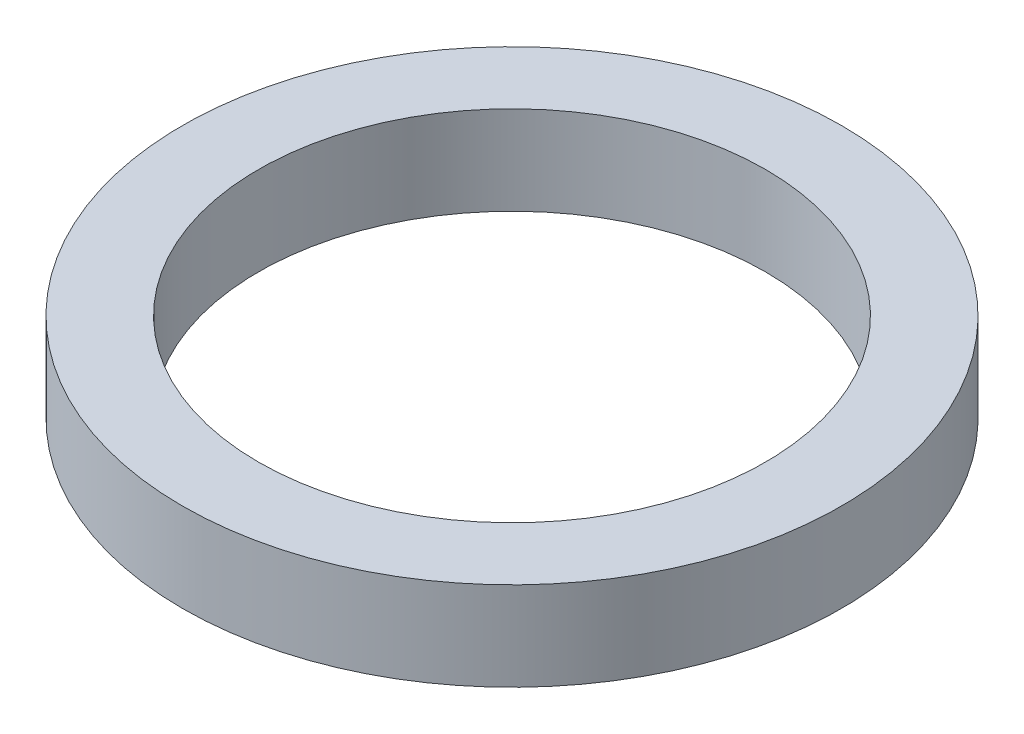
ISO-10303-21;
HEADER;
FILE_DESCRIPTION(('STEP AP214'),'2;1');
FILE_NAME('part.step','',(''),(''),'','','');
FILE_SCHEMA(('AUTOMOTIVE_DESIGN { 1 0 10303 214 1 1 1 1 }'));
ENDSEC;
DATA;
#1=APPLICATION_CONTEXT('core data for automotive mechanical design processes');
#2=APPLICATION_PROTOCOL_DEFINITION('international standard','automotive_design',2000,#1);
#3=PRODUCT_CONTEXT('',#1,'mechanical');
#4=PRODUCT('Part','Part','',(#3));
#5=PRODUCT_RELATED_PRODUCT_CATEGORY('part','',(#4));
#6=PRODUCT_DEFINITION_FORMATION('','',#4);
#7=PRODUCT_DEFINITION_CONTEXT('part definition',#1,'design');
#8=PRODUCT_DEFINITION('design','',#6,#7);
#9=PRODUCT_DEFINITION_SHAPE('','',#8);
#10=(LENGTH_UNIT() NAMED_UNIT(*) SI_UNIT(.MILLI.,.METRE.));
#11=(NAMED_UNIT(*) PLANE_ANGLE_UNIT() SI_UNIT($,.RADIAN.));
#12=(NAMED_UNIT(*) SI_UNIT($,.STERADIAN.) SOLID_ANGLE_UNIT());
#13=UNCERTAINTY_MEASURE_WITH_UNIT(LENGTH_MEASURE(1.E-05),#10,'distance_accuracy_value','');
#14=(GEOMETRIC_REPRESENTATION_CONTEXT(3) GLOBAL_UNCERTAINTY_ASSIGNED_CONTEXT((#13)) GLOBAL_UNIT_ASSIGNED_CONTEXT((#10,
#11,#12)) REPRESENTATION_CONTEXT('',''));
#15=CARTESIAN_POINT('',(0.,0.,0.));
#16=DIRECTION('',(0.,0.,1.));
#17=DIRECTION('',(1.,0.,0.));
#18=AXIS2_PLACEMENT_3D('',#15,#16,#17);
#19=CARTESIAN_POINT('',(0.,7.,0.));
#20=DIRECTION('',(0.,1.,0.));
#21=DIRECTION('',(0.,0.,1.));
#22=AXIS2_PLACEMENT_3D('',#19,#20,#21);
#23=PLANE('',#22);
#24=CARTESIAN_POINT('',(0.,7.,0.));
#25=DIRECTION('',(0.,1.,0.));
#26=DIRECTION('',(0.,0.,1.));
#27=AXIS2_PLACEMENT_3D('',#24,#25,#26);
#28=CIRCLE('',#27,26.);
#29=CARTESIAN_POINT('',(0.,7.,26.));
#30=VERTEX_POINT('',#29);
#31=EDGE_CURVE('E10',#30,#30,#28,.T.);
#32=ORIENTED_EDGE('',*,*,#31,.T.);
#33=EDGE_LOOP('',(#32));
#34=FACE_BOUND('',#33,.T.);
#35=CARTESIAN_POINT('',(0.,7.,0.));
#36=DIRECTION('',(0.,1.,0.));
#37=DIRECTION('',(0.,0.,1.));
#38=AXIS2_PLACEMENT_3D('',#35,#36,#37);
#39=CIRCLE('',#38,20.);
#40=CARTESIAN_POINT('',(0.,7.,20.));
#41=VERTEX_POINT('',#40);
#42=EDGE_CURVE('E56',#41,#41,#39,.T.);
#43=ORIENTED_EDGE('',*,*,#42,.F.);
#44=EDGE_LOOP('',(#43));
#45=FACE_BOUND('',#44,.T.);
#46=ADVANCED_FACE('F43',(#34,#45),#23,.T.);
#47=CARTESIAN_POINT('',(0.,0.,0.));
#48=DIRECTION('',(0.,1.,0.));
#49=DIRECTION('',(0.,0.,1.));
#50=AXIS2_PLACEMENT_3D('',#47,#48,#49);
#51=PLANE('',#50);
#52=CARTESIAN_POINT('',(0.,0.,0.));
#53=DIRECTION('',(0.,1.,0.));
#54=DIRECTION('',(0.,0.,1.));
#55=AXIS2_PLACEMENT_3D('',#52,#53,#54);
#56=CIRCLE('',#55,26.);
#57=CARTESIAN_POINT('',(0.,0.,26.));
#58=VERTEX_POINT('',#57);
#59=EDGE_CURVE('E47',#58,#58,#56,.T.);
#60=ORIENTED_EDGE('',*,*,#59,.F.);
#61=EDGE_LOOP('',(#60));
#62=FACE_BOUND('',#61,.T.);
#63=CARTESIAN_POINT('',(0.,0.,0.));
#64=DIRECTION('',(0.,1.,0.));
#65=DIRECTION('',(0.,0.,1.));
#66=AXIS2_PLACEMENT_3D('',#63,#64,#65);
#67=CIRCLE('',#66,20.);
#68=CARTESIAN_POINT('',(0.,0.,20.));
#69=VERTEX_POINT('',#68);
#70=EDGE_CURVE('E58',#69,#69,#67,.T.);
#71=ORIENTED_EDGE('',*,*,#70,.T.);
#72=EDGE_LOOP('',(#71));
#73=FACE_BOUND('',#72,.T.);
#74=ADVANCED_FACE('F70',(#62,#73),#51,.F.);
#75=CARTESIAN_POINT('',(0.,7.,0.));
#76=DIRECTION('',(0.,-1.,0.));
#77=DIRECTION('',(0.,0.,-1.));
#78=AXIS2_PLACEMENT_3D('',#75,#76,#77);
#79=CYLINDRICAL_SURFACE('',#78,26.);
#80=ORIENTED_EDGE('',*,*,#31,.F.);
#81=EDGE_LOOP('',(#80));
#82=FACE_BOUND('',#81,.T.);
#83=ORIENTED_EDGE('',*,*,#59,.T.);
#84=EDGE_LOOP('',(#83));
#85=FACE_BOUND('',#84,.T.);
#86=ADVANCED_FACE('F45',(#82,#85),#79,.T.);
#87=CARTESIAN_POINT('',(0.,7.,0.));
#88=DIRECTION('',(0.,-1.,0.));
#89=DIRECTION('',(0.,0.,-1.));
#90=AXIS2_PLACEMENT_3D('',#87,#88,#89);
#91=CYLINDRICAL_SURFACE('',#90,20.);
#92=ORIENTED_EDGE('',*,*,#42,.T.);
#93=EDGE_LOOP('',(#92));
#94=FACE_BOUND('',#93,.T.);
#95=ORIENTED_EDGE('',*,*,#70,.F.);
#96=EDGE_LOOP('',(#95));
#97=FACE_BOUND('',#96,.T.);
#98=ADVANCED_FACE('F66',(#94,#97),#91,.F.);
#99=CLOSED_SHELL('',(#46,#74,#86,#98));
#100=MANIFOLD_SOLID_BREP('B2',#99);
#101=ADVANCED_BREP_SHAPE_REPRESENTATION('',(#18,#100),#14);
#102=SHAPE_DEFINITION_REPRESENTATION(#9,#101);
ENDSEC;
END-ISO-10303-21;
